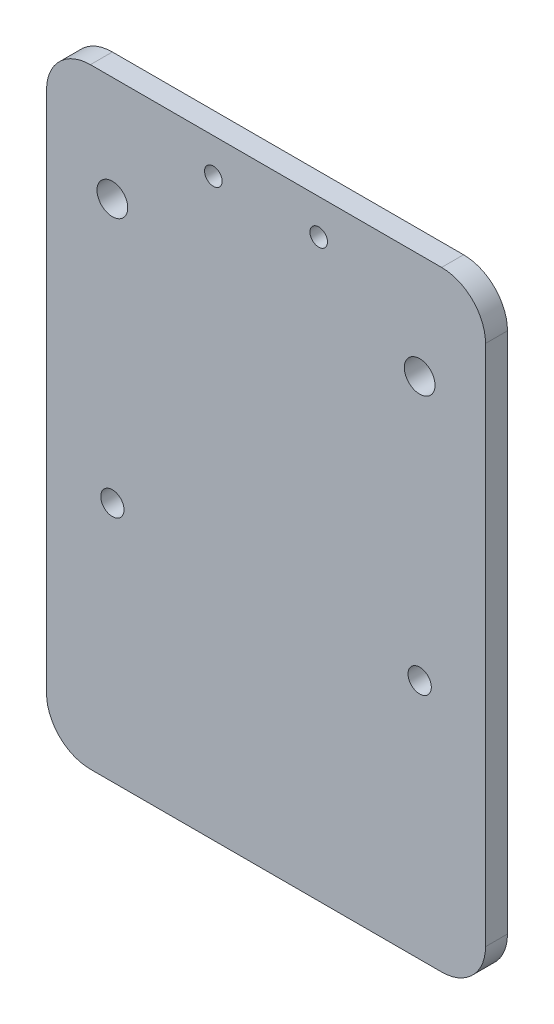
ISO-10303-21;
HEADER;
FILE_DESCRIPTION(('STEP AP214'),'2;1');
FILE_NAME('part.step','',(''),(''),'','','');
FILE_SCHEMA(('AUTOMOTIVE_DESIGN { 1 0 10303 214 1 1 1 1 }'));
ENDSEC;
DATA;
#1=APPLICATION_CONTEXT('core data for automotive mechanical design processes');
#2=APPLICATION_PROTOCOL_DEFINITION('international standard','automotive_design',2000,#1);
#3=PRODUCT_CONTEXT('',#1,'mechanical');
#4=PRODUCT('Part','Part','',(#3));
#5=PRODUCT_RELATED_PRODUCT_CATEGORY('part','',(#4));
#6=PRODUCT_DEFINITION_FORMATION('','',#4);
#7=PRODUCT_DEFINITION_CONTEXT('part definition',#1,'design');
#8=PRODUCT_DEFINITION('design','',#6,#7);
#9=PRODUCT_DEFINITION_SHAPE('','',#8);
#10=(LENGTH_UNIT() NAMED_UNIT(*) SI_UNIT(.MILLI.,.METRE.));
#11=(NAMED_UNIT(*) PLANE_ANGLE_UNIT() SI_UNIT($,.RADIAN.));
#12=(NAMED_UNIT(*) SI_UNIT($,.STERADIAN.) SOLID_ANGLE_UNIT());
#13=UNCERTAINTY_MEASURE_WITH_UNIT(LENGTH_MEASURE(1.E-05),#10,'distance_accuracy_value','');
#14=(GEOMETRIC_REPRESENTATION_CONTEXT(3) GLOBAL_UNCERTAINTY_ASSIGNED_CONTEXT((#13)) GLOBAL_UNIT_ASSIGNED_CONTEXT((#10,
#11,#12)) REPRESENTATION_CONTEXT('',''));
#15=CARTESIAN_POINT('',(0.,0.,0.));
#16=DIRECTION('',(0.,0.,1.));
#17=DIRECTION('',(1.,0.,0.));
#18=AXIS2_PLACEMENT_3D('',#15,#16,#17);
#19=CARTESIAN_POINT('',(0.,0.,5.));
#20=DIRECTION('',(-1.,0.,0.));
#21=DIRECTION('',(0.,0.,1.));
#22=AXIS2_PLACEMENT_3D('',#19,#20,#21);
#23=PLANE('',#22);
#24=DIRECTION('',(0.,1.,0.));
#25=VECTOR('',#24,1.);
#26=CARTESIAN_POINT('',(0.,0.,5.));
#27=LINE('',#26,#25);
#28=CARTESIAN_POINT('',(0.,10.,5.));
#29=VERTEX_POINT('',#28);
#30=CARTESIAN_POINT('',(0.,129.,5.));
#31=VERTEX_POINT('',#30);
#32=EDGE_CURVE('E198',#29,#31,#27,.T.);
#33=ORIENTED_EDGE('',*,*,#32,.T.);
#34=DIRECTION('',(0.,0.,-1.));
#35=VECTOR('',#34,1.);
#36=CARTESIAN_POINT('',(0.,129.,5.));
#37=LINE('',#36,#35);
#38=CARTESIAN_POINT('',(0.,129.,0.));
#39=VERTEX_POINT('',#38);
#40=EDGE_CURVE('E177',#31,#39,#37,.T.);
#41=ORIENTED_EDGE('',*,*,#40,.T.);
#42=DIRECTION('',(0.,1.,0.));
#43=VECTOR('',#42,1.);
#44=CARTESIAN_POINT('',(0.,0.,0.));
#45=LINE('',#44,#43);
#46=CARTESIAN_POINT('',(0.,10.,0.));
#47=VERTEX_POINT('',#46);
#48=EDGE_CURVE('E116',#47,#39,#45,.T.);
#49=ORIENTED_EDGE('',*,*,#48,.F.);
#50=DIRECTION('',(0.,0.,-1.));
#51=VECTOR('',#50,1.);
#52=CARTESIAN_POINT('',(0.,10.,5.));
#53=LINE('',#52,#51);
#54=EDGE_CURVE('E175',#47,#29,#53,.F.);
#55=ORIENTED_EDGE('',*,*,#54,.T.);
#56=EDGE_LOOP('',(#33,#41,#49,#55));
#57=FACE_BOUND('',#56,.T.);
#58=ADVANCED_FACE('F44',(#57),#23,.T.);
#59=CARTESIAN_POINT('',(0.,0.,5.));
#60=DIRECTION('',(0.,1.,0.));
#61=DIRECTION('',(0.,0.,1.));
#62=AXIS2_PLACEMENT_3D('',#59,#60,#61);
#63=PLANE('',#62);
#64=DIRECTION('',(1.,0.,0.));
#65=VECTOR('',#64,1.);
#66=CARTESIAN_POINT('',(0.,0.,5.));
#67=LINE('',#66,#65);
#68=CARTESIAN_POINT('',(10.,0.,5.));
#69=VERTEX_POINT('',#68);
#70=CARTESIAN_POINT('',(90.,0.,5.));
#71=VERTEX_POINT('',#70);
#72=EDGE_CURVE('E197',#69,#71,#67,.T.);
#73=ORIENTED_EDGE('',*,*,#72,.F.);
#74=DIRECTION('',(0.,0.,-1.));
#75=VECTOR('',#74,1.);
#76=CARTESIAN_POINT('',(10.,0.,0.));
#77=LINE('',#76,#75);
#78=CARTESIAN_POINT('',(10.,0.,0.));
#79=VERTEX_POINT('',#78);
#80=EDGE_CURVE('E11',#69,#79,#77,.T.);
#81=ORIENTED_EDGE('',*,*,#80,.T.);
#82=DIRECTION('',(1.,0.,0.));
#83=VECTOR('',#82,1.);
#84=CARTESIAN_POINT('',(0.,0.,0.));
#85=LINE('',#84,#83);
#86=CARTESIAN_POINT('',(90.,0.,0.));
#87=VERTEX_POINT('',#86);
#88=EDGE_CURVE('E189',#79,#87,#85,.T.);
#89=ORIENTED_EDGE('',*,*,#88,.T.);
#90=DIRECTION('',(0.,0.,-1.));
#91=VECTOR('',#90,1.);
#92=CARTESIAN_POINT('',(90.,0.,5.));
#93=LINE('',#92,#91);
#94=EDGE_CURVE('E53',#87,#71,#93,.F.);
#95=ORIENTED_EDGE('',*,*,#94,.T.);
#96=EDGE_LOOP('',(#73,#81,#89,#95));
#97=FACE_BOUND('',#96,.T.);
#98=ADVANCED_FACE('F302',(#97),#63,.F.);
#99=CARTESIAN_POINT('',(100.,0.,5.));
#100=DIRECTION('',(1.,0.,0.));
#101=DIRECTION('',(0.,1.,0.));
#102=AXIS2_PLACEMENT_3D('',#99,#100,#101);
#103=PLANE('',#102);
#104=DIRECTION('',(0.,-1.,0.));
#105=VECTOR('',#104,1.);
#106=CARTESIAN_POINT('',(100.,0.,0.));
#107=LINE('',#106,#105);
#108=CARTESIAN_POINT('',(100.,129.,0.));
#109=VERTEX_POINT('',#108);
#110=CARTESIAN_POINT('',(100.,10.,0.));
#111=VERTEX_POINT('',#110);
#112=EDGE_CURVE('E135',#109,#111,#107,.T.);
#113=ORIENTED_EDGE('',*,*,#112,.F.);
#114=DIRECTION('',(0.,0.,-1.));
#115=VECTOR('',#114,1.);
#116=CARTESIAN_POINT('',(100.,129.,5.));
#117=LINE('',#116,#115);
#118=CARTESIAN_POINT('',(100.,129.,5.));
#119=VERTEX_POINT('',#118);
#120=EDGE_CURVE('E163',#109,#119,#117,.F.);
#121=ORIENTED_EDGE('',*,*,#120,.T.);
#122=DIRECTION('',(0.,-1.,0.));
#123=VECTOR('',#122,1.);
#124=CARTESIAN_POINT('',(100.,0.,5.));
#125=LINE('',#124,#123);
#126=CARTESIAN_POINT('',(100.,10.,5.));
#127=VERTEX_POINT('',#126);
#128=EDGE_CURVE('E149',#119,#127,#125,.T.);
#129=ORIENTED_EDGE('',*,*,#128,.T.);
#130=DIRECTION('',(0.,0.,-1.));
#131=VECTOR('',#130,1.);
#132=CARTESIAN_POINT('',(100.,10.,0.));
#133=LINE('',#132,#131);
#134=EDGE_CURVE('E159',#127,#111,#133,.T.);
#135=ORIENTED_EDGE('',*,*,#134,.T.);
#136=EDGE_LOOP('',(#113,#121,#129,#135));
#137=FACE_BOUND('',#136,.T.);
#138=ADVANCED_FACE('F299',(#137),#103,.T.);
#139=CARTESIAN_POINT('',(15.,115.,5.));
#140=DIRECTION('',(0.,0.,-1.));
#141=DIRECTION('',(-1.,0.,0.));
#142=AXIS2_PLACEMENT_3D('',#139,#140,#141);
#143=CYLINDRICAL_SURFACE('',#142,3.5);
#144=CARTESIAN_POINT('',(15.,115.,5.));
#145=DIRECTION('',(0.,0.,1.));
#146=DIRECTION('',(1.,0.,0.));
#147=AXIS2_PLACEMENT_3D('',#144,#145,#146);
#148=CIRCLE('',#147,3.5);
#149=CARTESIAN_POINT('',(18.5,115.,5.));
#150=VERTEX_POINT('',#149);
#151=EDGE_CURVE('E195',#150,#150,#148,.T.);
#152=ORIENTED_EDGE('',*,*,#151,.T.);
#153=EDGE_LOOP('',(#152));
#154=FACE_BOUND('',#153,.T.);
#155=CARTESIAN_POINT('',(15.,115.,0.));
#156=DIRECTION('',(0.,0.,1.));
#157=DIRECTION('',(1.,0.,0.));
#158=AXIS2_PLACEMENT_3D('',#155,#156,#157);
#159=CIRCLE('',#158,3.5);
#160=CARTESIAN_POINT('',(18.5,115.,0.));
#161=VERTEX_POINT('',#160);
#162=EDGE_CURVE('E190',#161,#161,#159,.T.);
#163=ORIENTED_EDGE('',*,*,#162,.F.);
#164=EDGE_LOOP('',(#163));
#165=FACE_BOUND('',#164,.T.);
#166=ADVANCED_FACE('F316',(#154,#165),#143,.F.);
#167=CARTESIAN_POINT('',(85.,115.,5.));
#168=DIRECTION('',(0.,0.,-1.));
#169=DIRECTION('',(-1.,0.,0.));
#170=AXIS2_PLACEMENT_3D('',#167,#168,#169);
#171=CYLINDRICAL_SURFACE('',#170,3.50000000000001);
#172=CARTESIAN_POINT('',(85.,115.,5.));
#173=DIRECTION('',(0.,0.,1.));
#174=DIRECTION('',(1.,0.,0.));
#175=AXIS2_PLACEMENT_3D('',#172,#173,#174);
#176=CIRCLE('',#175,3.50000000000001);
#177=CARTESIAN_POINT('',(88.5,115.,5.));
#178=VERTEX_POINT('',#177);
#179=EDGE_CURVE('E192',#178,#178,#176,.T.);
#180=ORIENTED_EDGE('',*,*,#179,.T.);
#181=EDGE_LOOP('',(#180));
#182=FACE_BOUND('',#181,.T.);
#183=CARTESIAN_POINT('',(85.,115.,0.));
#184=DIRECTION('',(0.,0.,1.));
#185=DIRECTION('',(1.,0.,0.));
#186=AXIS2_PLACEMENT_3D('',#183,#184,#185);
#187=CIRCLE('',#186,3.50000000000001);
#188=CARTESIAN_POINT('',(88.5,115.,0.));
#189=VERTEX_POINT('',#188);
#190=EDGE_CURVE('E207',#189,#189,#187,.T.);
#191=ORIENTED_EDGE('',*,*,#190,.F.);
#192=EDGE_LOOP('',(#191));
#193=FACE_BOUND('',#192,.T.);
#194=ADVANCED_FACE('F319',(#182,#193),#171,.F.);
#195=CARTESIAN_POINT('',(15.,55.,5.));
#196=DIRECTION('',(0.,0.,-1.));
#197=DIRECTION('',(-1.,0.,0.));
#198=AXIS2_PLACEMENT_3D('',#195,#196,#197);
#199=CYLINDRICAL_SURFACE('',#198,2.65);
#200=CARTESIAN_POINT('',(15.,55.,5.));
#201=DIRECTION('',(0.,0.,1.));
#202=DIRECTION('',(1.,0.,0.));
#203=AXIS2_PLACEMENT_3D('',#200,#201,#202);
#204=CIRCLE('',#203,2.65);
#205=CARTESIAN_POINT('',(17.65,55.,5.));
#206=VERTEX_POINT('',#205);
#207=EDGE_CURVE('E181',#206,#206,#204,.T.);
#208=ORIENTED_EDGE('',*,*,#207,.T.);
#209=EDGE_LOOP('',(#208));
#210=FACE_BOUND('',#209,.T.);
#211=CARTESIAN_POINT('',(15.,55.,0.));
#212=DIRECTION('',(0.,0.,1.));
#213=DIRECTION('',(1.,0.,0.));
#214=AXIS2_PLACEMENT_3D('',#211,#212,#213);
#215=CIRCLE('',#214,2.65);
#216=CARTESIAN_POINT('',(17.65,55.,0.));
#217=VERTEX_POINT('',#216);
#218=EDGE_CURVE('E247',#217,#217,#215,.T.);
#219=ORIENTED_EDGE('',*,*,#218,.F.);
#220=EDGE_LOOP('',(#219));
#221=FACE_BOUND('',#220,.T.);
#222=ADVANCED_FACE('F279',(#210,#221),#199,.F.);
#223=CARTESIAN_POINT('',(85.,55.,5.));
#224=DIRECTION('',(0.,0.,-1.));
#225=DIRECTION('',(-1.,0.,0.));
#226=AXIS2_PLACEMENT_3D('',#223,#224,#225);
#227=CYLINDRICAL_SURFACE('',#226,2.65);
#228=CARTESIAN_POINT('',(85.,55.,5.));
#229=DIRECTION('',(0.,0.,1.));
#230=DIRECTION('',(1.,0.,0.));
#231=AXIS2_PLACEMENT_3D('',#228,#229,#230);
#232=CIRCLE('',#231,2.65);
#233=CARTESIAN_POINT('',(87.65,55.,5.));
#234=VERTEX_POINT('',#233);
#235=EDGE_CURVE('E213',#234,#234,#232,.T.);
#236=ORIENTED_EDGE('',*,*,#235,.T.);
#237=EDGE_LOOP('',(#236));
#238=FACE_BOUND('',#237,.T.);
#239=CARTESIAN_POINT('',(85.,55.,0.));
#240=DIRECTION('',(0.,0.,1.));
#241=DIRECTION('',(1.,0.,0.));
#242=AXIS2_PLACEMENT_3D('',#239,#240,#241);
#243=CIRCLE('',#242,2.65);
#244=CARTESIAN_POINT('',(87.65,55.,0.));
#245=VERTEX_POINT('',#244);
#246=EDGE_CURVE('E231',#245,#245,#243,.T.);
#247=ORIENTED_EDGE('',*,*,#246,.F.);
#248=EDGE_LOOP('',(#247));
#249=FACE_BOUND('',#248,.T.);
#250=ADVANCED_FACE('F326',(#238,#249),#227,.F.);
#251=CARTESIAN_POINT('',(38.,131.,5.));
#252=DIRECTION('',(0.,0.,-1.));
#253=DIRECTION('',(-1.,0.,0.));
#254=AXIS2_PLACEMENT_3D('',#251,#252,#253);
#255=CYLINDRICAL_SURFACE('',#254,2.);
#256=CARTESIAN_POINT('',(38.,131.,5.));
#257=DIRECTION('',(0.,0.,1.));
#258=DIRECTION('',(1.,0.,0.));
#259=AXIS2_PLACEMENT_3D('',#256,#257,#258);
#260=CIRCLE('',#259,2.);
#261=CARTESIAN_POINT('',(40.,131.,5.));
#262=VERTEX_POINT('',#261);
#263=EDGE_CURVE('E210',#262,#262,#260,.T.);
#264=ORIENTED_EDGE('',*,*,#263,.T.);
#265=EDGE_LOOP('',(#264));
#266=FACE_BOUND('',#265,.T.);
#267=CARTESIAN_POINT('',(38.,131.,0.));
#268=DIRECTION('',(0.,0.,1.));
#269=DIRECTION('',(1.,0.,0.));
#270=AXIS2_PLACEMENT_3D('',#267,#268,#269);
#271=CIRCLE('',#270,2.);
#272=CARTESIAN_POINT('',(40.,131.,0.));
#273=VERTEX_POINT('',#272);
#274=EDGE_CURVE('E227',#273,#273,#271,.T.);
#275=ORIENTED_EDGE('',*,*,#274,.F.);
#276=EDGE_LOOP('',(#275));
#277=FACE_BOUND('',#276,.T.);
#278=ADVANCED_FACE('F329',(#266,#277),#255,.F.);
#279=CARTESIAN_POINT('',(62.,131.,5.));
#280=DIRECTION('',(0.,0.,-1.));
#281=DIRECTION('',(-1.,0.,0.));
#282=AXIS2_PLACEMENT_3D('',#279,#280,#281);
#283=CYLINDRICAL_SURFACE('',#282,2.);
#284=CARTESIAN_POINT('',(62.,131.,5.));
#285=DIRECTION('',(0.,0.,1.));
#286=DIRECTION('',(1.,0.,0.));
#287=AXIS2_PLACEMENT_3D('',#284,#285,#286);
#288=CIRCLE('',#287,2.);
#289=CARTESIAN_POINT('',(64.,131.,5.));
#290=VERTEX_POINT('',#289);
#291=EDGE_CURVE('E134',#290,#290,#288,.T.);
#292=ORIENTED_EDGE('',*,*,#291,.T.);
#293=EDGE_LOOP('',(#292));
#294=FACE_BOUND('',#293,.T.);
#295=CARTESIAN_POINT('',(62.,131.,0.));
#296=DIRECTION('',(0.,0.,1.));
#297=DIRECTION('',(1.,0.,0.));
#298=AXIS2_PLACEMENT_3D('',#295,#296,#297);
#299=CIRCLE('',#298,2.);
#300=CARTESIAN_POINT('',(64.,131.,0.));
#301=VERTEX_POINT('',#300);
#302=EDGE_CURVE('E232',#301,#301,#299,.T.);
#303=ORIENTED_EDGE('',*,*,#302,.F.);
#304=EDGE_LOOP('',(#303));
#305=FACE_BOUND('',#304,.T.);
#306=ADVANCED_FACE('F333',(#294,#305),#283,.F.);
#307=CARTESIAN_POINT('',(0.,139.,5.));
#308=DIRECTION('',(0.,1.,0.));
#309=DIRECTION('',(0.,0.,1.));
#310=AXIS2_PLACEMENT_3D('',#307,#308,#309);
#311=PLANE('',#310);
#312=DIRECTION('',(1.,0.,0.));
#313=VECTOR('',#312,1.);
#314=CARTESIAN_POINT('',(0.,139.,5.));
#315=LINE('',#314,#313);
#316=CARTESIAN_POINT('',(10.,139.,5.));
#317=VERTEX_POINT('',#316);
#318=CARTESIAN_POINT('',(90.,139.,5.));
#319=VERTEX_POINT('',#318);
#320=EDGE_CURVE('E141',#317,#319,#315,.T.);
#321=ORIENTED_EDGE('',*,*,#320,.T.);
#322=DIRECTION('',(0.,0.,-1.));
#323=VECTOR('',#322,1.);
#324=CARTESIAN_POINT('',(90.,139.,5.));
#325=LINE('',#324,#323);
#326=CARTESIAN_POINT('',(90.,139.,0.));
#327=VERTEX_POINT('',#326);
#328=EDGE_CURVE('E132',#319,#327,#325,.T.);
#329=ORIENTED_EDGE('',*,*,#328,.T.);
#330=DIRECTION('',(1.,0.,0.));
#331=VECTOR('',#330,1.);
#332=CARTESIAN_POINT('',(0.,139.,0.));
#333=LINE('',#332,#331);
#334=CARTESIAN_POINT('',(10.,139.,0.));
#335=VERTEX_POINT('',#334);
#336=EDGE_CURVE('E114',#335,#327,#333,.T.);
#337=ORIENTED_EDGE('',*,*,#336,.F.);
#338=DIRECTION('',(0.,0.,-1.));
#339=VECTOR('',#338,1.);
#340=CARTESIAN_POINT('',(10.,139.,5.));
#341=LINE('',#340,#339);
#342=EDGE_CURVE('E129',#335,#317,#341,.F.);
#343=ORIENTED_EDGE('',*,*,#342,.T.);
#344=EDGE_LOOP('',(#321,#329,#337,#343));
#345=FACE_BOUND('',#344,.T.);
#346=ADVANCED_FACE('F128',(#345),#311,.T.);
#347=CARTESIAN_POINT('',(0.,0.,5.));
#348=DIRECTION('',(0.,0.,1.));
#349=DIRECTION('',(1.,0.,0.));
#350=AXIS2_PLACEMENT_3D('',#347,#348,#349);
#351=PLANE('',#350);
#352=ORIENTED_EDGE('',*,*,#291,.F.);
#353=EDGE_LOOP('',(#352));
#354=FACE_BOUND('',#353,.T.);
#355=ORIENTED_EDGE('',*,*,#263,.F.);
#356=EDGE_LOOP('',(#355));
#357=FACE_BOUND('',#356,.T.);
#358=ORIENTED_EDGE('',*,*,#235,.F.);
#359=EDGE_LOOP('',(#358));
#360=FACE_BOUND('',#359,.T.);
#361=ORIENTED_EDGE('',*,*,#207,.F.);
#362=EDGE_LOOP('',(#361));
#363=FACE_BOUND('',#362,.T.);
#364=ORIENTED_EDGE('',*,*,#179,.F.);
#365=EDGE_LOOP('',(#364));
#366=FACE_BOUND('',#365,.T.);
#367=ORIENTED_EDGE('',*,*,#151,.F.);
#368=EDGE_LOOP('',(#367));
#369=FACE_BOUND('',#368,.T.);
#370=ORIENTED_EDGE('',*,*,#128,.F.);
#371=CARTESIAN_POINT('',(90.,129.,5.));
#372=DIRECTION('',(0.,0.,1.));
#373=DIRECTION('',(1.,0.,0.));
#374=AXIS2_PLACEMENT_3D('',#371,#372,#373);
#375=CIRCLE('',#374,10.);
#376=EDGE_CURVE('E172',#119,#319,#375,.T.);
#377=ORIENTED_EDGE('',*,*,#376,.T.);
#378=ORIENTED_EDGE('',*,*,#320,.F.);
#379=CARTESIAN_POINT('',(10.,129.,5.));
#380=DIRECTION('',(0.,0.,1.));
#381=DIRECTION('',(1.,0.,0.));
#382=AXIS2_PLACEMENT_3D('',#379,#380,#381);
#383=CIRCLE('',#382,10.);
#384=EDGE_CURVE('E139',#317,#31,#383,.T.);
#385=ORIENTED_EDGE('',*,*,#384,.T.);
#386=ORIENTED_EDGE('',*,*,#32,.F.);
#387=CARTESIAN_POINT('',(10.,10.,5.));
#388=DIRECTION('',(0.,0.,1.));
#389=DIRECTION('',(1.,0.,0.));
#390=AXIS2_PLACEMENT_3D('',#387,#388,#389);
#391=CIRCLE('',#390,10.);
#392=EDGE_CURVE('E66',#29,#69,#391,.T.);
#393=ORIENTED_EDGE('',*,*,#392,.T.);
#394=ORIENTED_EDGE('',*,*,#72,.T.);
#395=CARTESIAN_POINT('',(90.,10.,5.));
#396=DIRECTION('',(0.,0.,1.));
#397=DIRECTION('',(1.,0.,0.));
#398=AXIS2_PLACEMENT_3D('',#395,#396,#397);
#399=CIRCLE('',#398,10.);
#400=EDGE_CURVE('E166',#71,#127,#399,.T.);
#401=ORIENTED_EDGE('',*,*,#400,.T.);
#402=EDGE_LOOP('',(#370,#377,#378,#385,#386,#393,#394,#401));
#403=FACE_BOUND('',#402,.T.);
#404=ADVANCED_FACE('F282',(#354,#357,#360,#363,#366,#369,#403),#351,.T.);
#405=CARTESIAN_POINT('',(0.,0.,0.));
#406=DIRECTION('',(0.,0.,1.));
#407=DIRECTION('',(1.,0.,0.));
#408=AXIS2_PLACEMENT_3D('',#405,#406,#407);
#409=PLANE('',#408);
#410=ORIENTED_EDGE('',*,*,#302,.T.);
#411=EDGE_LOOP('',(#410));
#412=FACE_BOUND('',#411,.T.);
#413=ORIENTED_EDGE('',*,*,#274,.T.);
#414=EDGE_LOOP('',(#413));
#415=FACE_BOUND('',#414,.T.);
#416=ORIENTED_EDGE('',*,*,#246,.T.);
#417=EDGE_LOOP('',(#416));
#418=FACE_BOUND('',#417,.T.);
#419=ORIENTED_EDGE('',*,*,#218,.T.);
#420=EDGE_LOOP('',(#419));
#421=FACE_BOUND('',#420,.T.);
#422=ORIENTED_EDGE('',*,*,#190,.T.);
#423=EDGE_LOOP('',(#422));
#424=FACE_BOUND('',#423,.T.);
#425=ORIENTED_EDGE('',*,*,#162,.T.);
#426=EDGE_LOOP('',(#425));
#427=FACE_BOUND('',#426,.T.);
#428=ORIENTED_EDGE('',*,*,#336,.T.);
#429=CARTESIAN_POINT('',(90.,129.,0.));
#430=DIRECTION('',(0.,0.,1.));
#431=DIRECTION('',(1.,0.,0.));
#432=AXIS2_PLACEMENT_3D('',#429,#430,#431);
#433=CIRCLE('',#432,10.);
#434=EDGE_CURVE('E122',#327,#109,#433,.F.);
#435=ORIENTED_EDGE('',*,*,#434,.T.);
#436=ORIENTED_EDGE('',*,*,#112,.T.);
#437=CARTESIAN_POINT('',(90.,10.,0.));
#438=DIRECTION('',(0.,0.,1.));
#439=DIRECTION('',(1.,0.,0.));
#440=AXIS2_PLACEMENT_3D('',#437,#438,#439);
#441=CIRCLE('',#440,10.);
#442=EDGE_CURVE('E146',#111,#87,#441,.F.);
#443=ORIENTED_EDGE('',*,*,#442,.T.);
#444=ORIENTED_EDGE('',*,*,#88,.F.);
#445=CARTESIAN_POINT('',(10.,10.,0.));
#446=DIRECTION('',(0.,0.,1.));
#447=DIRECTION('',(1.,0.,0.));
#448=AXIS2_PLACEMENT_3D('',#445,#446,#447);
#449=CIRCLE('',#448,10.);
#450=EDGE_CURVE('E123',#79,#47,#449,.F.);
#451=ORIENTED_EDGE('',*,*,#450,.T.);
#452=ORIENTED_EDGE('',*,*,#48,.T.);
#453=CARTESIAN_POINT('',(10.,129.,0.));
#454=DIRECTION('',(0.,0.,1.));
#455=DIRECTION('',(1.,0.,0.));
#456=AXIS2_PLACEMENT_3D('',#453,#454,#455);
#457=CIRCLE('',#456,10.);
#458=EDGE_CURVE('E111',#39,#335,#457,.F.);
#459=ORIENTED_EDGE('',*,*,#458,.T.);
#460=EDGE_LOOP('',(#428,#435,#436,#443,#444,#451,#452,#459));
#461=FACE_BOUND('',#460,.T.);
#462=ADVANCED_FACE('F113',(#412,#415,#418,#421,#424,#427,#461),#409,.F.);
#463=CARTESIAN_POINT('',(90.,129.,5.));
#464=DIRECTION('',(0.,0.,-1.));
#465=DIRECTION('',(-1.,0.,0.));
#466=AXIS2_PLACEMENT_3D('',#463,#464,#465);
#467=CYLINDRICAL_SURFACE('',#466,10.);
#468=ORIENTED_EDGE('',*,*,#376,.F.);
#469=ORIENTED_EDGE('',*,*,#120,.F.);
#470=ORIENTED_EDGE('',*,*,#434,.F.);
#471=ORIENTED_EDGE('',*,*,#328,.F.);
#472=EDGE_LOOP('',(#468,#469,#470,#471));
#473=FACE_BOUND('',#472,.T.);
#474=ADVANCED_FACE('F297',(#473),#467,.T.);
#475=CARTESIAN_POINT('',(10.,129.,5.));
#476=DIRECTION('',(0.,0.,-1.));
#477=DIRECTION('',(-1.,0.,0.));
#478=AXIS2_PLACEMENT_3D('',#475,#476,#477);
#479=CYLINDRICAL_SURFACE('',#478,10.);
#480=ORIENTED_EDGE('',*,*,#384,.F.);
#481=ORIENTED_EDGE('',*,*,#342,.F.);
#482=ORIENTED_EDGE('',*,*,#458,.F.);
#483=ORIENTED_EDGE('',*,*,#40,.F.);
#484=EDGE_LOOP('',(#480,#481,#482,#483));
#485=FACE_BOUND('',#484,.T.);
#486=ADVANCED_FACE('F138',(#485),#479,.T.);
#487=CARTESIAN_POINT('',(10.,10.,5.));
#488=DIRECTION('',(0.,0.,1.));
#489=DIRECTION('',(1.,0.,0.));
#490=AXIS2_PLACEMENT_3D('',#487,#488,#489);
#491=CYLINDRICAL_SURFACE('',#490,10.);
#492=ORIENTED_EDGE('',*,*,#392,.F.);
#493=ORIENTED_EDGE('',*,*,#54,.F.);
#494=ORIENTED_EDGE('',*,*,#450,.F.);
#495=ORIENTED_EDGE('',*,*,#80,.F.);
#496=EDGE_LOOP('',(#492,#493,#494,#495));
#497=FACE_BOUND('',#496,.T.);
#498=ADVANCED_FACE('F305',(#497),#491,.T.);
#499=CARTESIAN_POINT('',(90.,10.,5.));
#500=DIRECTION('',(0.,0.,1.));
#501=DIRECTION('',(1.,0.,0.));
#502=AXIS2_PLACEMENT_3D('',#499,#500,#501);
#503=CYLINDRICAL_SURFACE('',#502,10.);
#504=ORIENTED_EDGE('',*,*,#400,.F.);
#505=ORIENTED_EDGE('',*,*,#94,.F.);
#506=ORIENTED_EDGE('',*,*,#442,.F.);
#507=ORIENTED_EDGE('',*,*,#134,.F.);
#508=EDGE_LOOP('',(#504,#505,#506,#507));
#509=FACE_BOUND('',#508,.T.);
#510=ADVANCED_FACE('F46',(#509),#503,.T.);
#511=CLOSED_SHELL('',(#58,#98,#138,#166,#194,#222,#250,#278,#306,#346,#404,#462,#474,#486,#498,#510));
#512=MANIFOLD_SOLID_BREP('B2',#511);
#513=ADVANCED_BREP_SHAPE_REPRESENTATION('',(#18,#512),#14);
#514=SHAPE_DEFINITION_REPRESENTATION(#9,#513);
ENDSEC;
END-ISO-10303-21;
